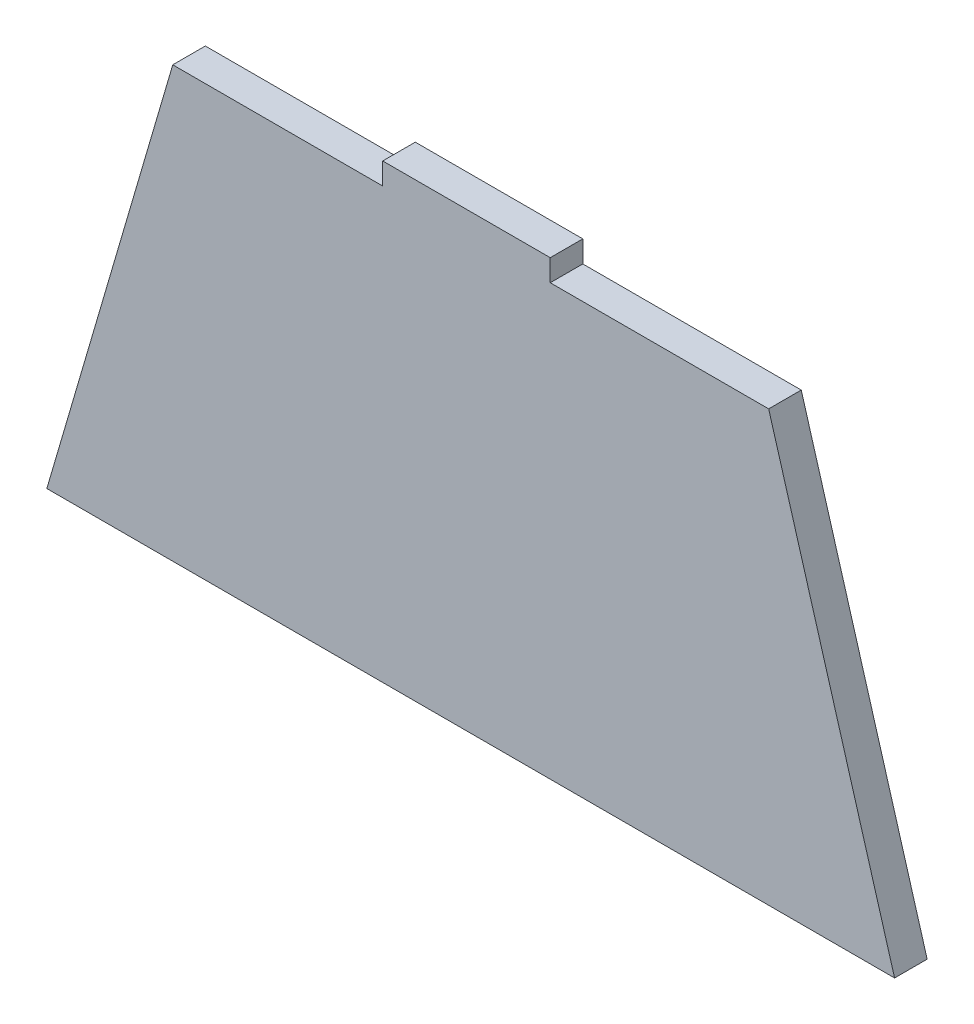
ISO-10303-21;
HEADER;
FILE_DESCRIPTION(('STEP AP214'),'2;1');
FILE_NAME('part.step','',(''),(''),'','','');
FILE_SCHEMA(('AUTOMOTIVE_DESIGN { 1 0 10303 214 1 1 1 1 }'));
ENDSEC;
DATA;
#1=APPLICATION_CONTEXT('core data for automotive mechanical design processes');
#2=APPLICATION_PROTOCOL_DEFINITION('international standard','automotive_design',2000,#1);
#3=PRODUCT_CONTEXT('',#1,'mechanical');
#4=PRODUCT('Part','Part','',(#3));
#5=PRODUCT_RELATED_PRODUCT_CATEGORY('part','',(#4));
#6=PRODUCT_DEFINITION_FORMATION('','',#4);
#7=PRODUCT_DEFINITION_CONTEXT('part definition',#1,'design');
#8=PRODUCT_DEFINITION('design','',#6,#7);
#9=PRODUCT_DEFINITION_SHAPE('','',#8);
#10=(LENGTH_UNIT() NAMED_UNIT(*) SI_UNIT(.MILLI.,.METRE.));
#11=(NAMED_UNIT(*) PLANE_ANGLE_UNIT() SI_UNIT($,.RADIAN.));
#12=(NAMED_UNIT(*) SI_UNIT($,.STERADIAN.) SOLID_ANGLE_UNIT());
#13=UNCERTAINTY_MEASURE_WITH_UNIT(LENGTH_MEASURE(1.E-05),#10,'distance_accuracy_value','');
#14=(GEOMETRIC_REPRESENTATION_CONTEXT(3) GLOBAL_UNCERTAINTY_ASSIGNED_CONTEXT((#13)) GLOBAL_UNIT_ASSIGNED_CONTEXT((#10,
#11,#12)) REPRESENTATION_CONTEXT('',''));
#15=CARTESIAN_POINT('',(0.,0.,0.));
#16=DIRECTION('',(0.,0.,1.));
#17=DIRECTION('',(1.,0.,0.));
#18=AXIS2_PLACEMENT_3D('',#15,#16,#17);
#19=CARTESIAN_POINT('',(-150.099486916197,138.632793349754,-9.525));
#20=DIRECTION('',(0.,1.,0.));
#21=DIRECTION('',(0.,0.,1.));
#22=AXIS2_PLACEMENT_3D('',#19,#20,#21);
#23=PLANE('',#22);
#24=DIRECTION('',(-1.,0.,0.));
#25=VECTOR('',#24,1.);
#26=CARTESIAN_POINT('',(-150.099486916197,138.632793349754,0.));
#27=LINE('',#26,#25);
#28=CARTESIAN_POINT('',(-150.099486916197,138.632793349754,0.));
#29=VERTEX_POINT('',#28);
#30=CARTESIAN_POINT('',(-211.493032124738,138.632793349754,0.));
#31=VERTEX_POINT('',#30);
#32=EDGE_CURVE('E130',#29,#31,#27,.T.);
#33=ORIENTED_EDGE('',*,*,#32,.F.);
#34=DIRECTION('',(0.,0.,1.));
#35=VECTOR('',#34,1.);
#36=CARTESIAN_POINT('',(-150.099486916197,138.632793349754,-9.525));
#37=LINE('',#36,#35);
#38=CARTESIAN_POINT('',(-150.099486916197,138.632793349754,-9.525));
#39=VERTEX_POINT('',#38);
#40=EDGE_CURVE('E11',#39,#29,#37,.T.);
#41=ORIENTED_EDGE('',*,*,#40,.F.);
#42=DIRECTION('',(-1.,0.,0.));
#43=VECTOR('',#42,1.);
#44=CARTESIAN_POINT('',(-150.099486916197,138.632793349754,-9.525));
#45=LINE('',#44,#43);
#46=CARTESIAN_POINT('',(-211.493032124738,138.632793349754,-9.525));
#47=VERTEX_POINT('',#46);
#48=EDGE_CURVE('E150',#39,#47,#45,.T.);
#49=ORIENTED_EDGE('',*,*,#48,.T.);
#50=DIRECTION('',(0.,0.,1.));
#51=VECTOR('',#50,1.);
#52=CARTESIAN_POINT('',(-211.493032124738,138.632793349754,-9.525));
#53=LINE('',#52,#51);
#54=EDGE_CURVE('E36',#47,#31,#53,.T.);
#55=ORIENTED_EDGE('',*,*,#54,.T.);
#56=EDGE_LOOP('',(#33,#41,#49,#55));
#57=FACE_BOUND('',#56,.T.);
#58=ADVANCED_FACE('F33',(#57),#23,.T.);
#59=CARTESIAN_POINT('',(-150.099486916197,138.632793349754,-9.525));
#60=DIRECTION('',(-1.,0.,0.));
#61=DIRECTION('',(0.,0.,1.));
#62=AXIS2_PLACEMENT_3D('',#59,#60,#61);
#63=PLANE('',#62);
#64=DIRECTION('',(0.,-1.,0.));
#65=VECTOR('',#64,1.);
#66=CARTESIAN_POINT('',(-150.099486916197,138.632793349754,0.));
#67=LINE('',#66,#65);
#68=CARTESIAN_POINT('',(-150.099486916197,144.982793349754,0.));
#69=VERTEX_POINT('',#68);
#70=EDGE_CURVE('E148',#69,#29,#67,.T.);
#71=ORIENTED_EDGE('',*,*,#70,.F.);
#72=DIRECTION('',(0.,0.,1.));
#73=VECTOR('',#72,1.);
#74=CARTESIAN_POINT('',(-150.099486916197,144.982793349754,-9.525));
#75=LINE('',#74,#73);
#76=CARTESIAN_POINT('',(-150.099486916197,144.982793349754,-9.525));
#77=VERTEX_POINT('',#76);
#78=EDGE_CURVE('E42',#77,#69,#75,.T.);
#79=ORIENTED_EDGE('',*,*,#78,.F.);
#80=DIRECTION('',(0.,-1.,0.));
#81=VECTOR('',#80,1.);
#82=CARTESIAN_POINT('',(-150.099486916197,138.632793349754,-9.525));
#83=LINE('',#82,#81);
#84=EDGE_CURVE('E120',#77,#39,#83,.T.);
#85=ORIENTED_EDGE('',*,*,#84,.T.);
#86=ORIENTED_EDGE('',*,*,#40,.T.);
#87=EDGE_LOOP('',(#71,#79,#85,#86));
#88=FACE_BOUND('',#87,.T.);
#89=ADVANCED_FACE('F162',(#88),#63,.T.);
#90=CARTESIAN_POINT('',(-150.099486916197,144.982793349754,-9.525));
#91=DIRECTION('',(0.,1.,0.));
#92=DIRECTION('',(0.,0.,1.));
#93=AXIS2_PLACEMENT_3D('',#90,#91,#92);
#94=PLANE('',#93);
#95=DIRECTION('',(-1.,0.,0.));
#96=VECTOR('',#95,1.);
#97=CARTESIAN_POINT('',(-150.099486916197,144.982793349754,0.));
#98=LINE('',#97,#96);
#99=CARTESIAN_POINT('',(-101.111008695625,144.982793349754,0.));
#100=VERTEX_POINT('',#99);
#101=EDGE_CURVE('E107',#100,#69,#98,.T.);
#102=ORIENTED_EDGE('',*,*,#101,.F.);
#103=DIRECTION('',(0.,0.,1.));
#104=VECTOR('',#103,1.);
#105=CARTESIAN_POINT('',(-101.111008695625,144.982793349754,-9.525));
#106=LINE('',#105,#104);
#107=CARTESIAN_POINT('',(-101.111008695625,144.982793349754,-9.525));
#108=VERTEX_POINT('',#107);
#109=EDGE_CURVE('E102',#108,#100,#106,.T.);
#110=ORIENTED_EDGE('',*,*,#109,.F.);
#111=DIRECTION('',(-1.,0.,0.));
#112=VECTOR('',#111,1.);
#113=CARTESIAN_POINT('',(-150.099486916197,144.982793349754,-9.525));
#114=LINE('',#113,#112);
#115=EDGE_CURVE('E105',#108,#77,#114,.T.);
#116=ORIENTED_EDGE('',*,*,#115,.T.);
#117=ORIENTED_EDGE('',*,*,#78,.T.);
#118=EDGE_LOOP('',(#102,#110,#116,#117));
#119=FACE_BOUND('',#118,.T.);
#120=ADVANCED_FACE('F104',(#119),#94,.T.);
#121=CARTESIAN_POINT('',(-101.111008695625,144.982793349754,-9.525));
#122=DIRECTION('',(1.,0.,0.));
#123=DIRECTION('',(0.,0.,-1.));
#124=AXIS2_PLACEMENT_3D('',#121,#122,#123);
#125=PLANE('',#124);
#126=DIRECTION('',(0.,1.,0.));
#127=VECTOR('',#126,1.);
#128=CARTESIAN_POINT('',(-101.111008695625,144.982793349754,0.));
#129=LINE('',#128,#127);
#130=CARTESIAN_POINT('',(-101.111008695625,138.632793349754,0.));
#131=VERTEX_POINT('',#130);
#132=EDGE_CURVE('E145',#131,#100,#129,.T.);
#133=ORIENTED_EDGE('',*,*,#132,.F.);
#134=DIRECTION('',(0.,0.,1.));
#135=VECTOR('',#134,1.);
#136=CARTESIAN_POINT('',(-101.111008695625,138.632793349754,-9.525));
#137=LINE('',#136,#135);
#138=CARTESIAN_POINT('',(-101.111008695625,138.632793349754,-9.525));
#139=VERTEX_POINT('',#138);
#140=EDGE_CURVE('E112',#139,#131,#137,.T.);
#141=ORIENTED_EDGE('',*,*,#140,.F.);
#142=DIRECTION('',(0.,1.,0.));
#143=VECTOR('',#142,1.);
#144=CARTESIAN_POINT('',(-101.111008695625,144.982793349754,-9.525));
#145=LINE('',#144,#143);
#146=EDGE_CURVE('E118',#139,#108,#145,.T.);
#147=ORIENTED_EDGE('',*,*,#146,.T.);
#148=ORIENTED_EDGE('',*,*,#109,.T.);
#149=EDGE_LOOP('',(#133,#141,#147,#148));
#150=FACE_BOUND('',#149,.T.);
#151=ADVANCED_FACE('F122',(#150),#125,.T.);
#152=CARTESIAN_POINT('',(-37.2363321247379,138.632793349754,-9.525));
#153=DIRECTION('',(0.,1.,0.));
#154=DIRECTION('',(0.,0.,1.));
#155=AXIS2_PLACEMENT_3D('',#152,#153,#154);
#156=PLANE('',#155);
#157=DIRECTION('',(-1.,0.,0.));
#158=VECTOR('',#157,1.);
#159=CARTESIAN_POINT('',(-37.2363321247379,138.632793349754,0.));
#160=LINE('',#159,#158);
#161=CARTESIAN_POINT('',(-37.2363321247379,138.632793349754,0.));
#162=VERTEX_POINT('',#161);
#163=EDGE_CURVE('E142',#162,#131,#160,.T.);
#164=ORIENTED_EDGE('',*,*,#163,.F.);
#165=DIRECTION('',(0.,0.,1.));
#166=VECTOR('',#165,1.);
#167=CARTESIAN_POINT('',(-37.2363321247379,138.632793349754,-9.525));
#168=LINE('',#167,#166);
#169=CARTESIAN_POINT('',(-37.2363321247379,138.632793349754,-9.525));
#170=VERTEX_POINT('',#169);
#171=EDGE_CURVE('E154',#170,#162,#168,.T.);
#172=ORIENTED_EDGE('',*,*,#171,.F.);
#173=DIRECTION('',(-1.,0.,0.));
#174=VECTOR('',#173,1.);
#175=CARTESIAN_POINT('',(-37.2363321247379,138.632793349754,-9.525));
#176=LINE('',#175,#174);
#177=EDGE_CURVE('E123',#170,#139,#176,.T.);
#178=ORIENTED_EDGE('',*,*,#177,.T.);
#179=ORIENTED_EDGE('',*,*,#140,.T.);
#180=EDGE_LOOP('',(#164,#172,#178,#179));
#181=FACE_BOUND('',#180,.T.);
#182=ADVANCED_FACE('F175',(#181),#156,.T.);
#183=CARTESIAN_POINT('',(-0.412682124737915,12.9104133497537,-9.525));
#184=DIRECTION('',(0.959682122690856,0.281087572453092,0.));
#185=DIRECTION('',(-0.281087572453092,0.959682122690856,0.));
#186=AXIS2_PLACEMENT_3D('',#183,#184,#185);
#187=PLANE('',#186);
#188=DIRECTION('',(-0.281087572453092,0.959682122690856,0.));
#189=VECTOR('',#188,1.);
#190=CARTESIAN_POINT('',(-0.412682124737915,12.9104133497537,0.));
#191=LINE('',#190,#189);
#192=CARTESIAN_POINT('',(-0.412682124737915,12.9104133497537,0.));
#193=VERTEX_POINT('',#192);
#194=EDGE_CURVE('E139',#193,#162,#191,.T.);
#195=ORIENTED_EDGE('',*,*,#194,.F.);
#196=DIRECTION('',(0.,0.,1.));
#197=VECTOR('',#196,1.);
#198=CARTESIAN_POINT('',(-0.412682124737915,12.9104133497537,-9.525));
#199=LINE('',#198,#197);
#200=CARTESIAN_POINT('',(-0.412682124737915,12.9104133497537,-9.525));
#201=VERTEX_POINT('',#200);
#202=EDGE_CURVE('E156',#201,#193,#199,.T.);
#203=ORIENTED_EDGE('',*,*,#202,.F.);
#204=DIRECTION('',(-0.281087572453092,0.959682122690856,0.));
#205=VECTOR('',#204,1.);
#206=CARTESIAN_POINT('',(-0.412682124737915,12.9104133497537,-9.525));
#207=LINE('',#206,#205);
#208=EDGE_CURVE('E125',#201,#170,#207,.T.);
#209=ORIENTED_EDGE('',*,*,#208,.T.);
#210=ORIENTED_EDGE('',*,*,#171,.T.);
#211=EDGE_LOOP('',(#195,#203,#209,#210));
#212=FACE_BOUND('',#211,.T.);
#213=ADVANCED_FACE('F178',(#212),#187,.T.);
#214=CARTESIAN_POINT('',(-248.316682124738,12.9104133497537,-9.525));
#215=DIRECTION('',(0.,-1.,0.));
#216=DIRECTION('',(0.,0.,-1.));
#217=AXIS2_PLACEMENT_3D('',#214,#215,#216);
#218=PLANE('',#217);
#219=DIRECTION('',(1.,0.,0.));
#220=VECTOR('',#219,1.);
#221=CARTESIAN_POINT('',(-248.316682124738,12.9104133497537,0.));
#222=LINE('',#221,#220);
#223=CARTESIAN_POINT('',(-248.316682124738,12.9104133497537,0.));
#224=VERTEX_POINT('',#223);
#225=EDGE_CURVE('E136',#224,#193,#222,.T.);
#226=ORIENTED_EDGE('',*,*,#225,.F.);
#227=DIRECTION('',(0.,0.,1.));
#228=VECTOR('',#227,1.);
#229=CARTESIAN_POINT('',(-248.316682124738,12.9104133497537,-9.525));
#230=LINE('',#229,#228);
#231=CARTESIAN_POINT('',(-248.316682124738,12.9104133497537,-9.525));
#232=VERTEX_POINT('',#231);
#233=EDGE_CURVE('E157',#232,#224,#230,.T.);
#234=ORIENTED_EDGE('',*,*,#233,.F.);
#235=DIRECTION('',(1.,0.,0.));
#236=VECTOR('',#235,1.);
#237=CARTESIAN_POINT('',(-248.316682124738,12.9104133497537,-9.525));
#238=LINE('',#237,#236);
#239=EDGE_CURVE('E253',#232,#201,#238,.T.);
#240=ORIENTED_EDGE('',*,*,#239,.T.);
#241=ORIENTED_EDGE('',*,*,#202,.T.);
#242=EDGE_LOOP('',(#226,#234,#240,#241));
#243=FACE_BOUND('',#242,.T.);
#244=ADVANCED_FACE('F182',(#243),#218,.T.);
#245=CARTESIAN_POINT('',(-211.493032124738,138.632793349754,-9.525));
#246=DIRECTION('',(-0.959682122690856,0.281087572453092,0.));
#247=DIRECTION('',(-0.281087572453092,-0.959682122690856,0.));
#248=AXIS2_PLACEMENT_3D('',#245,#246,#247);
#249=PLANE('',#248);
#250=DIRECTION('',(-0.281087572453092,-0.959682122690856,0.));
#251=VECTOR('',#250,1.);
#252=CARTESIAN_POINT('',(-211.493032124738,138.632793349754,0.));
#253=LINE('',#252,#251);
#254=EDGE_CURVE('E133',#31,#224,#253,.T.);
#255=ORIENTED_EDGE('',*,*,#254,.F.);
#256=ORIENTED_EDGE('',*,*,#54,.F.);
#257=DIRECTION('',(-0.281087572453092,-0.959682122690856,0.));
#258=VECTOR('',#257,1.);
#259=CARTESIAN_POINT('',(-211.493032124738,138.632793349754,-9.525));
#260=LINE('',#259,#258);
#261=EDGE_CURVE('E254',#47,#232,#260,.T.);
#262=ORIENTED_EDGE('',*,*,#261,.T.);
#263=ORIENTED_EDGE('',*,*,#233,.T.);
#264=EDGE_LOOP('',(#255,#256,#262,#263));
#265=FACE_BOUND('',#264,.T.);
#266=ADVANCED_FACE('F159',(#265),#249,.T.);
#267=CARTESIAN_POINT('',(0.,0.,-9.525));
#268=DIRECTION('',(0.,0.,1.));
#269=DIRECTION('',(1.,0.,0.));
#270=AXIS2_PLACEMENT_3D('',#267,#268,#269);
#271=PLANE('',#270);
#272=ORIENTED_EDGE('',*,*,#48,.F.);
#273=ORIENTED_EDGE('',*,*,#84,.F.);
#274=ORIENTED_EDGE('',*,*,#115,.F.);
#275=ORIENTED_EDGE('',*,*,#146,.F.);
#276=ORIENTED_EDGE('',*,*,#177,.F.);
#277=ORIENTED_EDGE('',*,*,#208,.F.);
#278=ORIENTED_EDGE('',*,*,#239,.F.);
#279=ORIENTED_EDGE('',*,*,#261,.F.);
#280=EDGE_LOOP('',(#272,#273,#274,#275,#276,#277,#278,#279));
#281=FACE_BOUND('',#280,.T.);
#282=ADVANCED_FACE('F116',(#281),#271,.F.);
#283=CARTESIAN_POINT('',(0.,0.,0.));
#284=DIRECTION('',(0.,0.,1.));
#285=DIRECTION('',(1.,0.,0.));
#286=AXIS2_PLACEMENT_3D('',#283,#284,#285);
#287=PLANE('',#286);
#288=ORIENTED_EDGE('',*,*,#32,.T.);
#289=ORIENTED_EDGE('',*,*,#254,.T.);
#290=ORIENTED_EDGE('',*,*,#225,.T.);
#291=ORIENTED_EDGE('',*,*,#194,.T.);
#292=ORIENTED_EDGE('',*,*,#163,.T.);
#293=ORIENTED_EDGE('',*,*,#132,.T.);
#294=ORIENTED_EDGE('',*,*,#101,.T.);
#295=ORIENTED_EDGE('',*,*,#70,.T.);
#296=EDGE_LOOP('',(#288,#289,#290,#291,#292,#293,#294,#295));
#297=FACE_BOUND('',#296,.T.);
#298=ADVANCED_FACE('F161',(#297),#287,.T.);
#299=CLOSED_SHELL('',(#58,#89,#120,#151,#182,#213,#244,#266,#282,#298));
#300=MANIFOLD_SOLID_BREP('B2',#299);
#301=ADVANCED_BREP_SHAPE_REPRESENTATION('',(#18,#300),#14);
#302=SHAPE_DEFINITION_REPRESENTATION(#9,#301);
ENDSEC;
END-ISO-10303-21;
